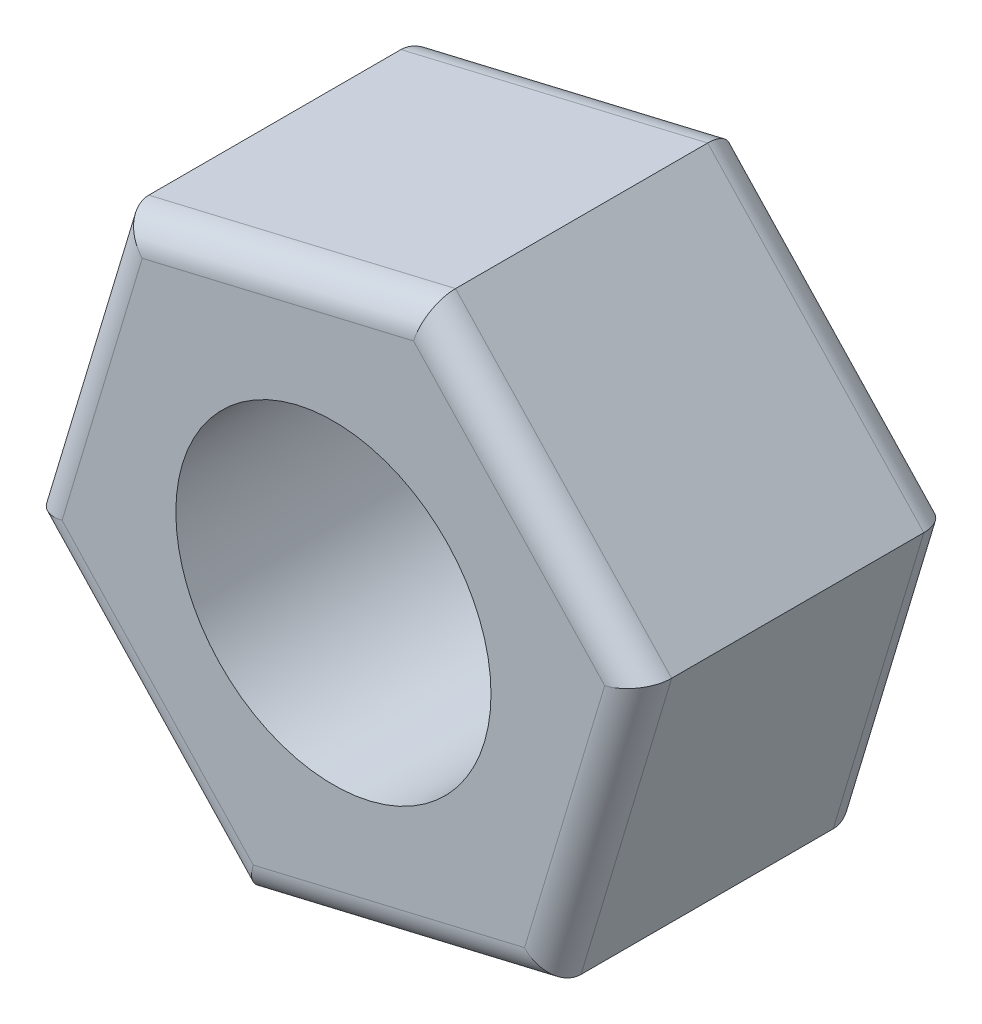
ISO-10303-21;
HEADER;
FILE_DESCRIPTION(('STEP AP214'),'2;1');
FILE_NAME('part.step','',(''),(''),'','','');
FILE_SCHEMA(('AUTOMOTIVE_DESIGN { 1 0 10303 214 1 1 1 1 }'));
ENDSEC;
DATA;
#1=APPLICATION_CONTEXT('core data for automotive mechanical design processes');
#2=APPLICATION_PROTOCOL_DEFINITION('international standard','automotive_design',2000,#1);
#3=PRODUCT_CONTEXT('',#1,'mechanical');
#4=PRODUCT('Part','Part','',(#3));
#5=PRODUCT_RELATED_PRODUCT_CATEGORY('part','',(#4));
#6=PRODUCT_DEFINITION_FORMATION('','',#4);
#7=PRODUCT_DEFINITION_CONTEXT('part definition',#1,'design');
#8=PRODUCT_DEFINITION('design','',#6,#7);
#9=PRODUCT_DEFINITION_SHAPE('','',#8);
#10=(LENGTH_UNIT() NAMED_UNIT(*) SI_UNIT(.MILLI.,.METRE.));
#11=(NAMED_UNIT(*) PLANE_ANGLE_UNIT() SI_UNIT($,.RADIAN.));
#12=(NAMED_UNIT(*) SI_UNIT($,.STERADIAN.) SOLID_ANGLE_UNIT());
#13=UNCERTAINTY_MEASURE_WITH_UNIT(LENGTH_MEASURE(1.E-05),#10,'distance_accuracy_value','');
#14=(GEOMETRIC_REPRESENTATION_CONTEXT(3) GLOBAL_UNCERTAINTY_ASSIGNED_CONTEXT((#13)) GLOBAL_UNIT_ASSIGNED_CONTEXT((#10,
#11,#12)) REPRESENTATION_CONTEXT('',''));
#15=CARTESIAN_POINT('',(0.,0.,0.));
#16=DIRECTION('',(0.,0.,1.));
#17=DIRECTION('',(1.,0.,0.));
#18=AXIS2_PLACEMENT_3D('',#15,#16,#17);
#19=CARTESIAN_POINT('',(9.73229975332995,2.29833450814581,10.));
#20=DIRECTION('',(0.,0.,1.));
#21=DIRECTION('',(1.,0.,0.));
#22=AXIS2_PLACEMENT_3D('',#19,#20,#21);
#23=PLANE('',#22);
#24=DIRECTION('',(-0.973229975332995,-0.229833450814581,0.));
#25=VECTOR('',#24,1.);
#26=CARTESIAN_POINT('',(-6.62673249629908,6.30602159422286,10.));
#27=LINE('',#26,#25);
#28=CARTESIAN_POINT('',(2.54367266878895,8.47166169767209,10.));
#29=VERTEX_POINT('',#28);
#30=CARTESIAN_POINT('',(-6.06483790805715,6.43871599891944,10.));
#31=VERTEX_POINT('',#30);
#32=EDGE_CURVE('E248',#29,#31,#27,.T.);
#33=ORIENTED_EDGE('',*,*,#32,.T.);
#34=DIRECTION('',(-0.287573380621629,-0.957758607770167,0.));
#35=VECTOR('',#34,1.);
#36=CARTESIAN_POINT('',(-8.77454114555978,-2.58590788876744,10.));
#37=LINE('',#36,#35);
#38=CARTESIAN_POINT('',(-8.60851057684611,-2.03294569875265,10.));
#39=VERTEX_POINT('',#38);
#40=EDGE_CURVE('E11',#31,#39,#37,.T.);
#41=ORIENTED_EDGE('',*,*,#40,.T.);
#42=DIRECTION('',(0.685656594711366,-0.727925156955586,0.));
#43=VECTOR('',#42,1.);
#44=CARTESIAN_POINT('',(-2.1478086492607,-8.8919294829903,10.));
#45=LINE('',#44,#43);
#46=CARTESIAN_POINT('',(-2.54367266878895,-8.47166169767209,10.));
#47=VERTEX_POINT('',#46);
#48=EDGE_CURVE('E40',#39,#47,#45,.T.);
#49=ORIENTED_EDGE('',*,*,#48,.T.);
#50=DIRECTION('',(0.973229975332995,0.229833450814581,0.));
#51=VECTOR('',#50,1.);
#52=CARTESIAN_POINT('',(6.62673249629908,-6.30602159422286,10.));
#53=LINE('',#52,#51);
#54=CARTESIAN_POINT('',(6.06483790805716,-6.43871599891944,10.));
#55=VERTEX_POINT('',#54);
#56=EDGE_CURVE('E254',#47,#55,#53,.T.);
#57=ORIENTED_EDGE('',*,*,#56,.T.);
#58=DIRECTION('',(0.287573380621629,0.957758607770167,0.));
#59=VECTOR('',#58,1.);
#60=CARTESIAN_POINT('',(8.77454114555978,2.58590788876744,10.));
#61=LINE('',#60,#59);
#62=CARTESIAN_POINT('',(8.60851057684611,2.03294569875266,10.));
#63=VERTEX_POINT('',#62);
#64=EDGE_CURVE('E252',#55,#63,#61,.T.);
#65=ORIENTED_EDGE('',*,*,#64,.T.);
#66=DIRECTION('',(-0.685656594711366,0.727925156955585,0.));
#67=VECTOR('',#66,1.);
#68=CARTESIAN_POINT('',(2.1478086492607,8.8919294829903,10.));
#69=LINE('',#68,#67);
#70=EDGE_CURVE('E250',#63,#29,#69,.T.);
#71=ORIENTED_EDGE('',*,*,#70,.T.);
#72=EDGE_LOOP('',(#33,#41,#49,#57,#65,#71));
#73=FACE_BOUND('',#72,.T.);
#74=CARTESIAN_POINT('',(0.,0.,10.));
#75=DIRECTION('',(0.,0.,1.));
#76=DIRECTION('',(1.,0.,0.));
#77=AXIS2_PLACEMENT_3D('',#74,#75,#76);
#78=CIRCLE('',#77,5.);
#79=CARTESIAN_POINT('',(5.,0.,10.));
#80=VERTEX_POINT('',#79);
#81=EDGE_CURVE('E201',#80,#80,#78,.T.);
#82=ORIENTED_EDGE('',*,*,#81,.F.);
#83=EDGE_LOOP('',(#82));
#84=FACE_BOUND('',#83,.T.);
#85=ADVANCED_FACE('F31',(#73,#84),#23,.T.);
#86=CARTESIAN_POINT('',(9.73229975332995,2.29833450814581,0.));
#87=DIRECTION('',(0.,0.,1.));
#88=DIRECTION('',(1.,0.,0.));
#89=AXIS2_PLACEMENT_3D('',#86,#87,#88);
#90=PLANE('',#89);
#91=DIRECTION('',(0.685656594711366,-0.727925156955586,0.));
#92=VECTOR('',#91,1.);
#93=CARTESIAN_POINT('',(-2.1478086492607,-8.89192948299029,0.));
#94=LINE('',#93,#92);
#95=CARTESIAN_POINT('',(-2.54367266878895,-8.47166169767209,0.));
#96=VERTEX_POINT('',#95);
#97=CARTESIAN_POINT('',(-8.60851057684611,-2.03294569875265,0.));
#98=VERTEX_POINT('',#97);
#99=EDGE_CURVE('E227',#96,#98,#94,.F.);
#100=ORIENTED_EDGE('',*,*,#99,.T.);
#101=DIRECTION('',(-0.287573380621629,-0.957758607770167,0.));
#102=VECTOR('',#101,1.);
#103=CARTESIAN_POINT('',(-5.89880733934349,6.99167818893422,0.));
#104=LINE('',#103,#102);
#105=CARTESIAN_POINT('',(-6.06483790805716,6.43871599891944,0.));
#106=VERTEX_POINT('',#105);
#107=EDGE_CURVE('E133',#98,#106,#104,.F.);
#108=ORIENTED_EDGE('',*,*,#107,.T.);
#109=DIRECTION('',(-0.973229975332995,-0.229833450814581,0.));
#110=VECTOR('',#109,1.);
#111=CARTESIAN_POINT('',(7.97171713369585,9.75352335644157,0.));
#112=LINE('',#111,#110);
#113=CARTESIAN_POINT('',(2.54367266878895,8.47166169767209,0.));
#114=VERTEX_POINT('',#113);
#115=EDGE_CURVE('E219',#106,#114,#112,.F.);
#116=ORIENTED_EDGE('',*,*,#115,.T.);
#117=DIRECTION('',(-0.685656594711366,0.727925156955585,0.));
#118=VECTOR('',#117,1.);
#119=CARTESIAN_POINT('',(9.00437459637436,1.61267791343445,0.));
#120=LINE('',#119,#118);
#121=CARTESIAN_POINT('',(8.60851057684611,2.03294569875266,0.));
#122=VERTEX_POINT('',#121);
#123=EDGE_CURVE('E221',#114,#122,#120,.F.);
#124=ORIENTED_EDGE('',*,*,#123,.T.);
#125=DIRECTION('',(0.287573380621629,0.957758607770167,0.));
#126=VECTOR('',#125,1.);
#127=CARTESIAN_POINT('',(8.77454114555978,2.58590788876744,0.));
#128=LINE('',#127,#126);
#129=CARTESIAN_POINT('',(6.06483790805716,-6.43871599891944,0.));
#130=VERTEX_POINT('',#129);
#131=EDGE_CURVE('E223',#122,#130,#128,.F.);
#132=ORIENTED_EDGE('',*,*,#131,.T.);
#133=DIRECTION('',(0.973229975332995,0.229833450814581,0.));
#134=VECTOR('',#133,1.);
#135=CARTESIAN_POINT('',(11.492882372964,-5.15685434014996,0.));
#136=LINE('',#135,#134);
#137=EDGE_CURVE('E225',#130,#96,#136,.F.);
#138=ORIENTED_EDGE('',*,*,#137,.T.);
#139=EDGE_LOOP('',(#100,#108,#116,#124,#132,#138));
#140=FACE_BOUND('',#139,.T.);
#141=CARTESIAN_POINT('',(0.,0.,0.));
#142=DIRECTION('',(0.,0.,1.));
#143=DIRECTION('',(1.,0.,0.));
#144=AXIS2_PLACEMENT_3D('',#141,#142,#143);
#145=CIRCLE('',#144,5.);
#146=CARTESIAN_POINT('',(5.,0.,0.));
#147=VERTEX_POINT('',#146);
#148=EDGE_CURVE('E195',#147,#147,#145,.T.);
#149=ORIENTED_EDGE('',*,*,#148,.T.);
#150=EDGE_LOOP('',(#149));
#151=FACE_BOUND('',#150,.T.);
#152=ADVANCED_FACE('F289',(#140,#151),#90,.F.);
#153=CARTESIAN_POINT('',(6.85656594711366,-7.27925156955586,10.));
#154=DIRECTION('',(-0.957758607770167,0.287573380621629,0.));
#155=DIRECTION('',(-0.287573380621629,-0.957758607770167,0.));
#156=AXIS2_PLACEMENT_3D('',#153,#154,#155);
#157=PLANE('',#156);
#158=DIRECTION('',(0.,0.,-1.));
#159=VECTOR('',#158,1.);
#160=CARTESIAN_POINT('',(6.85656594711366,-7.27925156955586,10.));
#161=LINE('',#160,#159);
#162=CARTESIAN_POINT('',(6.85656594711366,-7.27925156955586,9.));
#163=VERTEX_POINT('',#162);
#164=CARTESIAN_POINT('',(6.85656594711366,-7.27925156955586,0.999999999999999));
#165=VERTEX_POINT('',#164);
#166=EDGE_CURVE('E206',#163,#165,#161,.T.);
#167=ORIENTED_EDGE('',*,*,#166,.T.);
#168=DIRECTION('',(0.287573380621629,0.957758607770167,0.));
#169=VECTOR('',#168,1.);
#170=CARTESIAN_POINT('',(6.85656594711366,-7.27925156955586,0.999999999999999));
#171=LINE('',#170,#169);
#172=CARTESIAN_POINT('',(9.73229975332994,2.29833450814581,0.999999999999999));
#173=VERTEX_POINT('',#172);
#174=EDGE_CURVE('E238',#165,#173,#171,.T.);
#175=ORIENTED_EDGE('',*,*,#174,.T.);
#176=DIRECTION('',(0.,0.,-1.));
#177=VECTOR('',#176,1.);
#178=CARTESIAN_POINT('',(9.73229975332994,2.29833450814581,10.));
#179=LINE('',#178,#177);
#180=CARTESIAN_POINT('',(9.73229975332994,2.29833450814581,9.));
#181=VERTEX_POINT('',#180);
#182=EDGE_CURVE('E150',#181,#173,#179,.T.);
#183=ORIENTED_EDGE('',*,*,#182,.F.);
#184=DIRECTION('',(0.287573380621629,0.957758607770167,0.));
#185=VECTOR('',#184,1.);
#186=CARTESIAN_POINT('',(6.85656594711366,-7.27925156955586,9.));
#187=LINE('',#186,#185);
#188=EDGE_CURVE('E236',#181,#163,#187,.F.);
#189=ORIENTED_EDGE('',*,*,#188,.T.);
#190=EDGE_LOOP('',(#167,#175,#183,#189));
#191=FACE_BOUND('',#190,.T.);
#192=ADVANCED_FACE('F294',(#191),#157,.F.);
#193=CARTESIAN_POINT('',(9.73229975332994,2.29833450814581,10.));
#194=DIRECTION('',(-0.727925156955585,-0.685656594711366,0.));
#195=DIRECTION('',(0.685656594711366,-0.727925156955585,0.));
#196=AXIS2_PLACEMENT_3D('',#193,#194,#195);
#197=PLANE('',#196);
#198=ORIENTED_EDGE('',*,*,#182,.T.);
#199=DIRECTION('',(-0.685656594711366,0.727925156955585,0.));
#200=VECTOR('',#199,1.);
#201=CARTESIAN_POINT('',(9.73229975332994,2.29833450814581,0.999999999999999));
#202=LINE('',#201,#200);
#203=CARTESIAN_POINT('',(2.87573380621629,9.57758607770166,0.999999999999999));
#204=VERTEX_POINT('',#203);
#205=EDGE_CURVE('E242',#173,#204,#202,.T.);
#206=ORIENTED_EDGE('',*,*,#205,.T.);
#207=DIRECTION('',(0.,0.,-1.));
#208=VECTOR('',#207,1.);
#209=CARTESIAN_POINT('',(2.87573380621629,9.57758607770166,10.));
#210=LINE('',#209,#208);
#211=CARTESIAN_POINT('',(2.87573380621629,9.57758607770166,9.));
#212=VERTEX_POINT('',#211);
#213=EDGE_CURVE('E213',#212,#204,#210,.T.);
#214=ORIENTED_EDGE('',*,*,#213,.F.);
#215=DIRECTION('',(-0.685656594711366,0.727925156955585,0.));
#216=VECTOR('',#215,1.);
#217=CARTESIAN_POINT('',(9.73229975332994,2.29833450814581,9.));
#218=LINE('',#217,#216);
#219=EDGE_CURVE('E240',#212,#181,#218,.F.);
#220=ORIENTED_EDGE('',*,*,#219,.T.);
#221=EDGE_LOOP('',(#198,#206,#214,#220));
#222=FACE_BOUND('',#221,.T.);
#223=ADVANCED_FACE('F269',(#222),#197,.F.);
#224=CARTESIAN_POINT('',(2.87573380621629,9.57758607770166,10.));
#225=DIRECTION('',(0.229833450814581,-0.973229975332995,0.));
#226=DIRECTION('',(0.973229975332995,0.229833450814581,0.));
#227=AXIS2_PLACEMENT_3D('',#224,#225,#226);
#228=PLANE('',#227);
#229=ORIENTED_EDGE('',*,*,#213,.T.);
#230=DIRECTION('',(-0.973229975332995,-0.229833450814581,0.));
#231=VECTOR('',#230,1.);
#232=CARTESIAN_POINT('',(2.87573380621629,9.57758607770166,0.999999999999999));
#233=LINE('',#232,#231);
#234=CARTESIAN_POINT('',(-6.85656594711365,7.27925156955586,0.999999999999999));
#235=VERTEX_POINT('',#234);
#236=EDGE_CURVE('E246',#204,#235,#233,.T.);
#237=ORIENTED_EDGE('',*,*,#236,.T.);
#238=DIRECTION('',(0.,0.,-1.));
#239=VECTOR('',#238,1.);
#240=CARTESIAN_POINT('',(-6.85656594711365,7.27925156955586,10.));
#241=LINE('',#240,#239);
#242=CARTESIAN_POINT('',(-6.85656594711365,7.27925156955586,9.));
#243=VERTEX_POINT('',#242);
#244=EDGE_CURVE('E144',#243,#235,#241,.T.);
#245=ORIENTED_EDGE('',*,*,#244,.F.);
#246=DIRECTION('',(-0.973229975332995,-0.229833450814581,0.));
#247=VECTOR('',#246,1.);
#248=CARTESIAN_POINT('',(2.87573380621629,9.57758607770166,9.));
#249=LINE('',#248,#247);
#250=EDGE_CURVE('E244',#243,#212,#249,.F.);
#251=ORIENTED_EDGE('',*,*,#250,.T.);
#252=EDGE_LOOP('',(#229,#237,#245,#251));
#253=FACE_BOUND('',#252,.T.);
#254=ADVANCED_FACE('F266',(#253),#228,.F.);
#255=CARTESIAN_POINT('',(-6.85656594711365,7.27925156955586,10.));
#256=DIRECTION('',(0.957758607770167,-0.287573380621629,0.));
#257=DIRECTION('',(0.287573380621629,0.957758607770167,0.));
#258=AXIS2_PLACEMENT_3D('',#255,#256,#257);
#259=PLANE('',#258);
#260=ORIENTED_EDGE('',*,*,#244,.T.);
#261=DIRECTION('',(-0.287573380621629,-0.957758607770167,0.));
#262=VECTOR('',#261,1.);
#263=CARTESIAN_POINT('',(-6.85656594711365,7.27925156955586,0.999999999999999));
#264=LINE('',#263,#262);
#265=CARTESIAN_POINT('',(-9.73229975332994,-2.29833450814581,0.999999999999999));
#266=VERTEX_POINT('',#265);
#267=EDGE_CURVE('E143',#235,#266,#264,.T.);
#268=ORIENTED_EDGE('',*,*,#267,.T.);
#269=DIRECTION('',(0.,0.,-1.));
#270=VECTOR('',#269,1.);
#271=CARTESIAN_POINT('',(-9.73229975332994,-2.29833450814581,10.));
#272=LINE('',#271,#270);
#273=CARTESIAN_POINT('',(-9.73229975332994,-2.29833450814581,9.));
#274=VERTEX_POINT('',#273);
#275=EDGE_CURVE('E126',#274,#266,#272,.T.);
#276=ORIENTED_EDGE('',*,*,#275,.F.);
#277=DIRECTION('',(-0.287573380621629,-0.957758607770167,0.));
#278=VECTOR('',#277,1.);
#279=CARTESIAN_POINT('',(-6.85656594711365,7.27925156955586,9.));
#280=LINE('',#279,#278);
#281=EDGE_CURVE('E140',#274,#243,#280,.F.);
#282=ORIENTED_EDGE('',*,*,#281,.T.);
#283=EDGE_LOOP('',(#260,#268,#276,#282));
#284=FACE_BOUND('',#283,.T.);
#285=ADVANCED_FACE('F139',(#284),#259,.F.);
#286=CARTESIAN_POINT('',(-9.73229975332994,-2.29833450814581,10.));
#287=DIRECTION('',(0.727925156955586,0.685656594711366,0.));
#288=DIRECTION('',(-0.685656594711366,0.727925156955586,0.));
#289=AXIS2_PLACEMENT_3D('',#286,#287,#288);
#290=PLANE('',#289);
#291=ORIENTED_EDGE('',*,*,#275,.T.);
#292=DIRECTION('',(0.685656594711366,-0.727925156955586,0.));
#293=VECTOR('',#292,1.);
#294=CARTESIAN_POINT('',(-9.73229975332994,-2.29833450814581,0.999999999999999));
#295=LINE('',#294,#293);
#296=CARTESIAN_POINT('',(-2.87573380621628,-9.57758607770167,0.999999999999999));
#297=VERTEX_POINT('',#296);
#298=EDGE_CURVE('E132',#266,#297,#295,.T.);
#299=ORIENTED_EDGE('',*,*,#298,.T.);
#300=DIRECTION('',(0.,0.,-1.));
#301=VECTOR('',#300,1.);
#302=CARTESIAN_POINT('',(-2.87573380621628,-9.57758607770167,10.));
#303=LINE('',#302,#301);
#304=CARTESIAN_POINT('',(-2.87573380621628,-9.57758607770167,9.));
#305=VERTEX_POINT('',#304);
#306=EDGE_CURVE('E128',#305,#297,#303,.T.);
#307=ORIENTED_EDGE('',*,*,#306,.F.);
#308=DIRECTION('',(0.685656594711366,-0.727925156955586,0.));
#309=VECTOR('',#308,1.);
#310=CARTESIAN_POINT('',(-9.73229975332994,-2.29833450814581,9.));
#311=LINE('',#310,#309);
#312=EDGE_CURVE('E123',#305,#274,#311,.F.);
#313=ORIENTED_EDGE('',*,*,#312,.T.);
#314=EDGE_LOOP('',(#291,#299,#307,#313));
#315=FACE_BOUND('',#314,.T.);
#316=ADVANCED_FACE('F125',(#315),#290,.F.);
#317=CARTESIAN_POINT('',(-2.87573380621628,-9.57758607770167,10.));
#318=DIRECTION('',(-0.229833450814581,0.973229975332995,0.));
#319=DIRECTION('',(-0.973229975332995,-0.229833450814581,0.));
#320=AXIS2_PLACEMENT_3D('',#317,#318,#319);
#321=PLANE('',#320);
#322=ORIENTED_EDGE('',*,*,#306,.T.);
#323=DIRECTION('',(0.973229975332995,0.229833450814581,0.));
#324=VECTOR('',#323,1.);
#325=CARTESIAN_POINT('',(-2.87573380621628,-9.57758607770167,0.999999999999999));
#326=LINE('',#325,#324);
#327=EDGE_CURVE('E234',#297,#165,#326,.T.);
#328=ORIENTED_EDGE('',*,*,#327,.T.);
#329=ORIENTED_EDGE('',*,*,#166,.F.);
#330=DIRECTION('',(0.973229975332995,0.229833450814581,0.));
#331=VECTOR('',#330,1.);
#332=CARTESIAN_POINT('',(-2.87573380621628,-9.57758607770167,9.));
#333=LINE('',#332,#331);
#334=EDGE_CURVE('E232',#163,#305,#333,.F.);
#335=ORIENTED_EDGE('',*,*,#334,.T.);
#336=EDGE_LOOP('',(#322,#328,#329,#335));
#337=FACE_BOUND('',#336,.T.);
#338=ADVANCED_FACE('F300',(#337),#321,.F.);
#339=CARTESIAN_POINT('',(0.,0.,10.));
#340=DIRECTION('',(0.,0.,-1.));
#341=DIRECTION('',(-1.,0.,0.));
#342=AXIS2_PLACEMENT_3D('',#339,#340,#341);
#343=CYLINDRICAL_SURFACE('',#342,5.);
#344=ORIENTED_EDGE('',*,*,#81,.T.);
#345=EDGE_LOOP('',(#344));
#346=FACE_BOUND('',#345,.T.);
#347=ORIENTED_EDGE('',*,*,#148,.F.);
#348=EDGE_LOOP('',(#347));
#349=FACE_BOUND('',#348,.T.);
#350=ADVANCED_FACE('F298',(#346,#349),#343,.F.);
#351=CARTESIAN_POINT('',(5.89880733934349,-6.99167818893423,0.999999999999999));
#352=DIRECTION('',(0.287573380621629,0.957758607770167,0.));
#353=DIRECTION('',(-0.957758607770167,0.287573380621629,0.));
#354=AXIS2_PLACEMENT_3D('',#351,#352,#353);
#355=CYLINDRICAL_SURFACE('',#354,1.);
#356=CARTESIAN_POINT('',(6.06483790805716,-6.43871599891944,0.999999999999999));
#357=DIRECTION('',(0.727925156955585,0.685656594711366,0.));
#358=DIRECTION('',(-0.685656594711366,0.727925156955586,0.));
#359=AXIS2_PLACEMENT_3D('',#356,#357,#358);
#360=ELLIPSE('',#359,1.15470053837925,1.);
#361=EDGE_CURVE('E188',#130,#165,#360,.F.);
#362=ORIENTED_EDGE('',*,*,#361,.F.);
#363=ORIENTED_EDGE('',*,*,#131,.F.);
#364=CARTESIAN_POINT('',(8.60851057684611,2.03294569875266,0.999999999999999));
#365=DIRECTION('',(-0.229833450814581,0.973229975332995,0.));
#366=DIRECTION('',(-0.973229975332995,-0.229833450814581,0.));
#367=AXIS2_PLACEMENT_3D('',#364,#365,#366);
#368=ELLIPSE('',#367,1.15470053837925,1.);
#369=EDGE_CURVE('E157',#173,#122,#368,.T.);
#370=ORIENTED_EDGE('',*,*,#369,.F.);
#371=ORIENTED_EDGE('',*,*,#174,.F.);
#372=EDGE_LOOP('',(#362,#363,#370,#371));
#373=FACE_BOUND('',#372,.T.);
#374=ADVANCED_FACE('F318',(#373),#355,.T.);
#375=CARTESIAN_POINT('',(9.00437459637436,1.61267791343445,0.999999999999999));
#376=DIRECTION('',(-0.685656594711366,0.727925156955585,0.));
#377=DIRECTION('',(-0.727925156955585,-0.685656594711366,0.));
#378=AXIS2_PLACEMENT_3D('',#375,#376,#377);
#379=CYLINDRICAL_SURFACE('',#378,1.);
#380=ORIENTED_EDGE('',*,*,#369,.T.);
#381=ORIENTED_EDGE('',*,*,#123,.F.);
#382=CARTESIAN_POINT('',(2.54367266878895,8.47166169767209,0.999999999999999));
#383=DIRECTION('',(-0.957758607770167,0.287573380621629,0.));
#384=DIRECTION('',(-0.287573380621629,-0.957758607770167,0.));
#385=AXIS2_PLACEMENT_3D('',#382,#383,#384);
#386=ELLIPSE('',#385,1.15470053837925,1.);
#387=EDGE_CURVE('E186',#204,#114,#386,.T.);
#388=ORIENTED_EDGE('',*,*,#387,.F.);
#389=ORIENTED_EDGE('',*,*,#205,.F.);
#390=EDGE_LOOP('',(#380,#381,#388,#389));
#391=FACE_BOUND('',#390,.T.);
#392=ADVANCED_FACE('F271',(#391),#379,.T.);
#393=CARTESIAN_POINT('',(-3.10556725703086,-8.60435610236867,0.999999999999999));
#394=DIRECTION('',(0.973229975332995,0.229833450814581,0.));
#395=DIRECTION('',(-0.229833450814581,0.973229975332995,0.));
#396=AXIS2_PLACEMENT_3D('',#393,#394,#395);
#397=CYLINDRICAL_SURFACE('',#396,1.);
#398=ORIENTED_EDGE('',*,*,#361,.T.);
#399=ORIENTED_EDGE('',*,*,#327,.F.);
#400=CARTESIAN_POINT('',(-2.54367266878895,-8.47166169767209,0.999999999999999));
#401=DIRECTION('',(0.957758607770167,-0.287573380621629,0.));
#402=DIRECTION('',(0.287573380621629,0.957758607770167,0.));
#403=AXIS2_PLACEMENT_3D('',#400,#401,#402);
#404=ELLIPSE('',#403,1.15470053837925,1.);
#405=EDGE_CURVE('E180',#96,#297,#404,.F.);
#406=ORIENTED_EDGE('',*,*,#405,.F.);
#407=ORIENTED_EDGE('',*,*,#137,.F.);
#408=EDGE_LOOP('',(#398,#399,#406,#407));
#409=FACE_BOUND('',#408,.T.);
#410=ADVANCED_FACE('F322',(#409),#397,.T.);
#411=CARTESIAN_POINT('',(3.10556725703087,8.60435610236867,0.999999999999999));
#412=DIRECTION('',(-0.973229975332995,-0.229833450814581,0.));
#413=DIRECTION('',(0.229833450814581,-0.973229975332995,0.));
#414=AXIS2_PLACEMENT_3D('',#411,#412,#413);
#415=CYLINDRICAL_SURFACE('',#414,1.);
#416=ORIENTED_EDGE('',*,*,#387,.T.);
#417=ORIENTED_EDGE('',*,*,#115,.F.);
#418=CARTESIAN_POINT('',(-6.06483790805715,6.43871599891944,0.999999999999999));
#419=DIRECTION('',(-0.727925156955586,-0.685656594711366,0.));
#420=DIRECTION('',(-0.685656594711366,0.727925156955586,0.));
#421=AXIS2_PLACEMENT_3D('',#418,#419,#420);
#422=ELLIPSE('',#421,1.15470053837925,1.);
#423=EDGE_CURVE('E174',#235,#106,#422,.T.);
#424=ORIENTED_EDGE('',*,*,#423,.F.);
#425=ORIENTED_EDGE('',*,*,#236,.F.);
#426=EDGE_LOOP('',(#416,#417,#424,#425));
#427=FACE_BOUND('',#426,.T.);
#428=ADVANCED_FACE('F276',(#427),#415,.T.);
#429=CARTESIAN_POINT('',(-9.00437459637435,-1.61267791343444,0.999999999999999));
#430=DIRECTION('',(0.685656594711366,-0.727925156955586,0.));
#431=DIRECTION('',(0.727925156955586,0.685656594711366,0.));
#432=AXIS2_PLACEMENT_3D('',#429,#430,#431);
#433=CYLINDRICAL_SURFACE('',#432,1.);
#434=ORIENTED_EDGE('',*,*,#405,.T.);
#435=ORIENTED_EDGE('',*,*,#298,.F.);
#436=CARTESIAN_POINT('',(-8.60851057684611,-2.03294569875265,0.999999999999999));
#437=DIRECTION('',(0.229833450814581,-0.973229975332995,0.));
#438=DIRECTION('',(0.973229975332995,0.229833450814581,0.));
#439=AXIS2_PLACEMENT_3D('',#436,#437,#438);
#440=ELLIPSE('',#439,1.15470053837925,1.);
#441=EDGE_CURVE('E169',#98,#266,#440,.F.);
#442=ORIENTED_EDGE('',*,*,#441,.F.);
#443=ORIENTED_EDGE('',*,*,#99,.F.);
#444=EDGE_LOOP('',(#434,#435,#442,#443));
#445=FACE_BOUND('',#444,.T.);
#446=ADVANCED_FACE('F279',(#445),#433,.T.);
#447=CARTESIAN_POINT('',(-5.89880733934349,6.99167818893423,0.999999999999999));
#448=DIRECTION('',(-0.287573380621629,-0.957758607770167,0.));
#449=DIRECTION('',(0.957758607770167,-0.287573380621629,0.));
#450=AXIS2_PLACEMENT_3D('',#447,#448,#449);
#451=CYLINDRICAL_SURFACE('',#450,1.);
#452=ORIENTED_EDGE('',*,*,#423,.T.);
#453=ORIENTED_EDGE('',*,*,#107,.F.);
#454=ORIENTED_EDGE('',*,*,#441,.T.);
#455=ORIENTED_EDGE('',*,*,#267,.F.);
#456=EDGE_LOOP('',(#452,#453,#454,#455));
#457=FACE_BOUND('',#456,.T.);
#458=ADVANCED_FACE('F277',(#457),#451,.T.);
#459=CARTESIAN_POINT('',(8.77454114555978,2.58590788876744,9.));
#460=DIRECTION('',(-0.287573380621629,-0.957758607770167,0.));
#461=DIRECTION('',(0.957758607770167,-0.287573380621629,0.));
#462=AXIS2_PLACEMENT_3D('',#459,#460,#461);
#463=CYLINDRICAL_SURFACE('',#462,1.);
#464=CARTESIAN_POINT('',(6.06483790805716,-6.43871599891944,9.));
#465=DIRECTION('',(-0.727925156955585,-0.685656594711366,0.));
#466=DIRECTION('',(0.685656594711366,-0.727925156955586,0.));
#467=AXIS2_PLACEMENT_3D('',#464,#465,#466);
#468=ELLIPSE('',#467,1.15470053837925,1.);
#469=EDGE_CURVE('E163',#163,#55,#468,.T.);
#470=ORIENTED_EDGE('',*,*,#469,.F.);
#471=ORIENTED_EDGE('',*,*,#188,.F.);
#472=CARTESIAN_POINT('',(8.60851057684611,2.03294569875266,9.));
#473=DIRECTION('',(0.229833450814581,-0.973229975332995,0.));
#474=DIRECTION('',(0.973229975332995,0.229833450814581,0.));
#475=AXIS2_PLACEMENT_3D('',#472,#473,#474);
#476=ELLIPSE('',#475,1.15470053837925,1.);
#477=EDGE_CURVE('E35',#63,#181,#476,.F.);
#478=ORIENTED_EDGE('',*,*,#477,.F.);
#479=ORIENTED_EDGE('',*,*,#64,.F.);
#480=EDGE_LOOP('',(#470,#471,#478,#479));
#481=FACE_BOUND('',#480,.T.);
#482=ADVANCED_FACE('F33',(#481),#463,.T.);
#483=CARTESIAN_POINT('',(9.00437459637436,1.61267791343445,9.));
#484=DIRECTION('',(0.685656594711366,-0.727925156955585,0.));
#485=DIRECTION('',(0.727925156955585,0.685656594711366,0.));
#486=AXIS2_PLACEMENT_3D('',#483,#484,#485);
#487=CYLINDRICAL_SURFACE('',#486,1.);
#488=ORIENTED_EDGE('',*,*,#477,.T.);
#489=ORIENTED_EDGE('',*,*,#219,.F.);
#490=CARTESIAN_POINT('',(2.54367266878895,8.47166169767209,9.));
#491=DIRECTION('',(0.957758607770167,-0.287573380621629,0.));
#492=DIRECTION('',(0.287573380621629,0.957758607770167,0.));
#493=AXIS2_PLACEMENT_3D('',#490,#491,#492);
#494=ELLIPSE('',#493,1.15470053837925,1.);
#495=EDGE_CURVE('E161',#29,#212,#494,.F.);
#496=ORIENTED_EDGE('',*,*,#495,.F.);
#497=ORIENTED_EDGE('',*,*,#70,.F.);
#498=EDGE_LOOP('',(#488,#489,#496,#497));
#499=FACE_BOUND('',#498,.T.);
#500=ADVANCED_FACE('F260',(#499),#487,.T.);
#501=CARTESIAN_POINT('',(11.492882372964,-5.15685434014996,9.));
#502=DIRECTION('',(-0.973229975332995,-0.229833450814581,0.));
#503=DIRECTION('',(0.229833450814581,-0.973229975332995,0.));
#504=AXIS2_PLACEMENT_3D('',#501,#502,#503);
#505=CYLINDRICAL_SURFACE('',#504,1.);
#506=ORIENTED_EDGE('',*,*,#469,.T.);
#507=ORIENTED_EDGE('',*,*,#56,.F.);
#508=CARTESIAN_POINT('',(-2.54367266878895,-8.47166169767209,9.));
#509=DIRECTION('',(-0.957758607770167,0.287573380621629,0.));
#510=DIRECTION('',(-0.287573380621629,-0.957758607770167,0.));
#511=AXIS2_PLACEMENT_3D('',#508,#509,#510);
#512=ELLIPSE('',#511,1.15470053837925,1.);
#513=EDGE_CURVE('E154',#305,#47,#512,.T.);
#514=ORIENTED_EDGE('',*,*,#513,.F.);
#515=ORIENTED_EDGE('',*,*,#334,.F.);
#516=EDGE_LOOP('',(#506,#507,#514,#515));
#517=FACE_BOUND('',#516,.T.);
#518=ADVANCED_FACE('F340',(#517),#505,.T.);
#519=CARTESIAN_POINT('',(7.97171713369585,9.75352335644157,9.));
#520=DIRECTION('',(0.973229975332995,0.229833450814581,0.));
#521=DIRECTION('',(-0.229833450814581,0.973229975332995,0.));
#522=AXIS2_PLACEMENT_3D('',#519,#520,#521);
#523=CYLINDRICAL_SURFACE('',#522,1.);
#524=ORIENTED_EDGE('',*,*,#495,.T.);
#525=ORIENTED_EDGE('',*,*,#250,.F.);
#526=CARTESIAN_POINT('',(-6.06483790805715,6.43871599891944,9.));
#527=DIRECTION('',(0.727925156955586,0.685656594711366,0.));
#528=DIRECTION('',(0.685656594711366,-0.727925156955586,0.));
#529=AXIS2_PLACEMENT_3D('',#526,#527,#528);
#530=ELLIPSE('',#529,1.15470053837925,1.);
#531=EDGE_CURVE('E148',#31,#243,#530,.F.);
#532=ORIENTED_EDGE('',*,*,#531,.F.);
#533=ORIENTED_EDGE('',*,*,#32,.F.);
#534=EDGE_LOOP('',(#524,#525,#532,#533));
#535=FACE_BOUND('',#534,.T.);
#536=ADVANCED_FACE('F263',(#535),#523,.T.);
#537=CARTESIAN_POINT('',(-2.1478086492607,-8.8919294829903,9.));
#538=DIRECTION('',(-0.685656594711366,0.727925156955586,0.));
#539=DIRECTION('',(-0.727925156955586,-0.685656594711366,0.));
#540=AXIS2_PLACEMENT_3D('',#537,#538,#539);
#541=CYLINDRICAL_SURFACE('',#540,1.);
#542=ORIENTED_EDGE('',*,*,#513,.T.);
#543=ORIENTED_EDGE('',*,*,#48,.F.);
#544=CARTESIAN_POINT('',(-8.60851057684611,-2.03294569875266,9.));
#545=DIRECTION('',(-0.229833450814581,0.973229975332995,0.));
#546=DIRECTION('',(-0.973229975332995,-0.229833450814581,0.));
#547=AXIS2_PLACEMENT_3D('',#544,#545,#546);
#548=ELLIPSE('',#547,1.15470053837925,1.);
#549=EDGE_CURVE('E48',#274,#39,#548,.T.);
#550=ORIENTED_EDGE('',*,*,#549,.F.);
#551=ORIENTED_EDGE('',*,*,#312,.F.);
#552=EDGE_LOOP('',(#542,#543,#550,#551));
#553=FACE_BOUND('',#552,.T.);
#554=ADVANCED_FACE('F152',(#553),#541,.T.);
#555=CARTESIAN_POINT('',(-5.89880733934349,6.99167818893422,9.));
#556=DIRECTION('',(0.287573380621629,0.957758607770167,0.));
#557=DIRECTION('',(-0.957758607770167,0.287573380621629,0.));
#558=AXIS2_PLACEMENT_3D('',#555,#556,#557);
#559=CYLINDRICAL_SURFACE('',#558,1.);
#560=ORIENTED_EDGE('',*,*,#531,.T.);
#561=ORIENTED_EDGE('',*,*,#281,.F.);
#562=ORIENTED_EDGE('',*,*,#549,.T.);
#563=ORIENTED_EDGE('',*,*,#40,.F.);
#564=EDGE_LOOP('',(#560,#561,#562,#563));
#565=FACE_BOUND('',#564,.T.);
#566=ADVANCED_FACE('F146',(#565),#559,.T.);
#567=CLOSED_SHELL('',(#85,#152,#192,#223,#254,#285,#316,#338,#350,#374,#392,#410,#428,#446,#458,
#482,#500,#518,#536,#554,#566));
#568=MANIFOLD_SOLID_BREP('B2',#567);
#569=ADVANCED_BREP_SHAPE_REPRESENTATION('',(#18,#568),#14);
#570=SHAPE_DEFINITION_REPRESENTATION(#9,#569);
ENDSEC;
END-ISO-10303-21;
